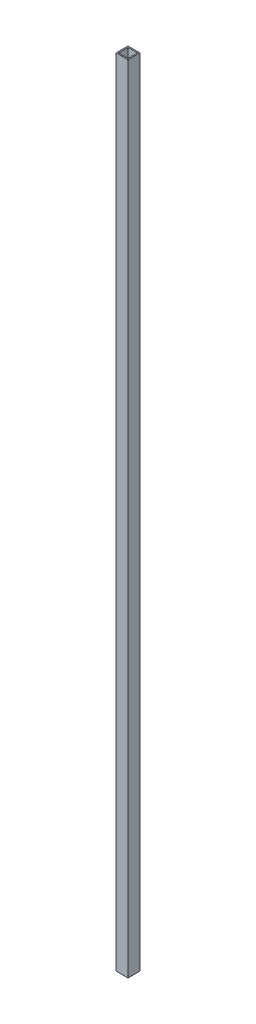
ISO-10303-21;
HEADER;
FILE_DESCRIPTION(('STEP AP214'),'2;1');
FILE_NAME('part.step','',(''),(''),'','','');
FILE_SCHEMA(('AUTOMOTIVE_DESIGN { 1 0 10303 214 1 1 1 1 }'));
ENDSEC;
DATA;
#1=APPLICATION_CONTEXT('core data for automotive mechanical design processes');
#2=APPLICATION_PROTOCOL_DEFINITION('international standard','automotive_design',2000,#1);
#3=PRODUCT_CONTEXT('',#1,'mechanical');
#4=PRODUCT('Part','Part','',(#3));
#5=PRODUCT_RELATED_PRODUCT_CATEGORY('part','',(#4));
#6=PRODUCT_DEFINITION_FORMATION('','',#4);
#7=PRODUCT_DEFINITION_CONTEXT('part definition',#1,'design');
#8=PRODUCT_DEFINITION('design','',#6,#7);
#9=PRODUCT_DEFINITION_SHAPE('','',#8);
#10=(LENGTH_UNIT() NAMED_UNIT(*) SI_UNIT(.MILLI.,.METRE.));
#11=(NAMED_UNIT(*) PLANE_ANGLE_UNIT() SI_UNIT($,.RADIAN.));
#12=(NAMED_UNIT(*) SI_UNIT($,.STERADIAN.) SOLID_ANGLE_UNIT());
#13=UNCERTAINTY_MEASURE_WITH_UNIT(LENGTH_MEASURE(1.E-05),#10,'distance_accuracy_value','');
#14=(GEOMETRIC_REPRESENTATION_CONTEXT(3) GLOBAL_UNCERTAINTY_ASSIGNED_CONTEXT((#13)) GLOBAL_UNIT_ASSIGNED_CONTEXT((#10,
#11,#12)) REPRESENTATION_CONTEXT('',''));
#15=CARTESIAN_POINT('',(0.,0.,0.));
#16=DIRECTION('',(0.,0.,1.));
#17=DIRECTION('',(1.,0.,0.));
#18=AXIS2_PLACEMENT_3D('',#15,#16,#17);
#19=CARTESIAN_POINT('',(0.,1000.,0.));
#20=DIRECTION('',(0.,-1.,0.));
#21=DIRECTION('',(0.,0.,-1.));
#22=AXIS2_PLACEMENT_3D('',#19,#20,#21);
#23=PLANE('',#22);
#24=DIRECTION('',(0.,0.,1.));
#25=VECTOR('',#24,1.);
#26=CARTESIAN_POINT('',(0.,1000.,0.));
#27=LINE('',#26,#25);
#28=CARTESIAN_POINT('',(0.,1000.,-15.));
#29=VERTEX_POINT('',#28);
#30=CARTESIAN_POINT('',(0.,1000.,0.));
#31=VERTEX_POINT('',#30);
#32=EDGE_CURVE('E140',#29,#31,#27,.T.);
#33=ORIENTED_EDGE('',*,*,#32,.T.);
#34=DIRECTION('',(1.,0.,0.));
#35=VECTOR('',#34,1.);
#36=CARTESIAN_POINT('',(0.,1000.,0.));
#37=LINE('',#36,#35);
#38=CARTESIAN_POINT('',(15.,1000.,0.));
#39=VERTEX_POINT('',#38);
#40=EDGE_CURVE('E143',#31,#39,#37,.T.);
#41=ORIENTED_EDGE('',*,*,#40,.T.);
#42=DIRECTION('',(0.,0.,-1.));
#43=VECTOR('',#42,1.);
#44=CARTESIAN_POINT('',(15.,1000.,0.));
#45=LINE('',#44,#43);
#46=CARTESIAN_POINT('',(15.,1000.,-15.));
#47=VERTEX_POINT('',#46);
#48=EDGE_CURVE('E146',#39,#47,#45,.T.);
#49=ORIENTED_EDGE('',*,*,#48,.T.);
#50=DIRECTION('',(-1.,0.,0.));
#51=VECTOR('',#50,1.);
#52=CARTESIAN_POINT('',(0.,1000.,-15.));
#53=LINE('',#52,#51);
#54=EDGE_CURVE('E148',#47,#29,#53,.T.);
#55=ORIENTED_EDGE('',*,*,#54,.T.);
#56=EDGE_LOOP('',(#33,#41,#49,#55));
#57=FACE_BOUND('',#56,.T.);
#58=DIRECTION('',(1.,0.,0.));
#59=VECTOR('',#58,1.);
#60=CARTESIAN_POINT('',(1.5,1000.,-1.5));
#61=LINE('',#60,#59);
#62=CARTESIAN_POINT('',(1.5,1000.,-1.5));
#63=VERTEX_POINT('',#62);
#64=CARTESIAN_POINT('',(13.5,1000.,-1.5));
#65=VERTEX_POINT('',#64);
#66=EDGE_CURVE('E104',#63,#65,#61,.T.);
#67=ORIENTED_EDGE('',*,*,#66,.F.);
#68=DIRECTION('',(0.,0.,1.));
#69=VECTOR('',#68,1.);
#70=CARTESIAN_POINT('',(1.5,1000.,-1.5));
#71=LINE('',#70,#69);
#72=CARTESIAN_POINT('',(1.5,1000.,-13.5));
#73=VERTEX_POINT('',#72);
#74=EDGE_CURVE('E126',#73,#63,#71,.T.);
#75=ORIENTED_EDGE('',*,*,#74,.F.);
#76=DIRECTION('',(-1.,0.,0.));
#77=VECTOR('',#76,1.);
#78=CARTESIAN_POINT('',(1.5,1000.,-13.5));
#79=LINE('',#78,#77);
#80=CARTESIAN_POINT('',(13.5,1000.,-13.5));
#81=VERTEX_POINT('',#80);
#82=EDGE_CURVE('E124',#81,#73,#79,.T.);
#83=ORIENTED_EDGE('',*,*,#82,.F.);
#84=DIRECTION('',(0.,0.,-1.));
#85=VECTOR('',#84,1.);
#86=CARTESIAN_POINT('',(13.5,1000.,-1.5));
#87=LINE('',#86,#85);
#88=EDGE_CURVE('E112',#65,#81,#87,.T.);
#89=ORIENTED_EDGE('',*,*,#88,.F.);
#90=EDGE_LOOP('',(#67,#75,#83,#89));
#91=FACE_BOUND('',#90,.T.);
#92=ADVANCED_FACE('F39',(#57,#91),#23,.F.);
#93=CARTESIAN_POINT('',(0.,0.,0.));
#94=DIRECTION('',(0.,-1.,0.));
#95=DIRECTION('',(0.,0.,-1.));
#96=AXIS2_PLACEMENT_3D('',#93,#94,#95);
#97=PLANE('',#96);
#98=DIRECTION('',(0.,0.,1.));
#99=VECTOR('',#98,1.);
#100=CARTESIAN_POINT('',(0.,0.,0.));
#101=LINE('',#100,#99);
#102=CARTESIAN_POINT('',(0.,0.,-15.));
#103=VERTEX_POINT('',#102);
#104=CARTESIAN_POINT('',(0.,0.,0.));
#105=VERTEX_POINT('',#104);
#106=EDGE_CURVE('E120',#103,#105,#101,.T.);
#107=ORIENTED_EDGE('',*,*,#106,.F.);
#108=DIRECTION('',(-1.,0.,0.));
#109=VECTOR('',#108,1.);
#110=CARTESIAN_POINT('',(0.,0.,-15.));
#111=LINE('',#110,#109);
#112=CARTESIAN_POINT('',(15.,0.,-15.));
#113=VERTEX_POINT('',#112);
#114=EDGE_CURVE('E144',#113,#103,#111,.T.);
#115=ORIENTED_EDGE('',*,*,#114,.F.);
#116=DIRECTION('',(0.,0.,-1.));
#117=VECTOR('',#116,1.);
#118=CARTESIAN_POINT('',(15.,0.,0.));
#119=LINE('',#118,#117);
#120=CARTESIAN_POINT('',(15.,0.,0.));
#121=VERTEX_POINT('',#120);
#122=EDGE_CURVE('E155',#121,#113,#119,.T.);
#123=ORIENTED_EDGE('',*,*,#122,.F.);
#124=DIRECTION('',(1.,0.,0.));
#125=VECTOR('',#124,1.);
#126=CARTESIAN_POINT('',(0.,0.,0.));
#127=LINE('',#126,#125);
#128=EDGE_CURVE('E153',#105,#121,#127,.T.);
#129=ORIENTED_EDGE('',*,*,#128,.F.);
#130=EDGE_LOOP('',(#107,#115,#123,#129));
#131=FACE_BOUND('',#130,.T.);
#132=DIRECTION('',(0.,0.,1.));
#133=VECTOR('',#132,1.);
#134=CARTESIAN_POINT('',(1.5,0.,-1.5));
#135=LINE('',#134,#133);
#136=CARTESIAN_POINT('',(1.5,0.,-13.5));
#137=VERTEX_POINT('',#136);
#138=CARTESIAN_POINT('',(1.5,0.,-1.5));
#139=VERTEX_POINT('',#138);
#140=EDGE_CURVE('E113',#137,#139,#135,.T.);
#141=ORIENTED_EDGE('',*,*,#140,.T.);
#142=DIRECTION('',(1.,0.,0.));
#143=VECTOR('',#142,1.);
#144=CARTESIAN_POINT('',(1.5,0.,-1.5));
#145=LINE('',#144,#143);
#146=CARTESIAN_POINT('',(13.5,0.,-1.5));
#147=VERTEX_POINT('',#146);
#148=EDGE_CURVE('E62',#139,#147,#145,.T.);
#149=ORIENTED_EDGE('',*,*,#148,.T.);
#150=DIRECTION('',(0.,0.,-1.));
#151=VECTOR('',#150,1.);
#152=CARTESIAN_POINT('',(13.5,0.,-1.5));
#153=LINE('',#152,#151);
#154=CARTESIAN_POINT('',(13.5,0.,-13.5));
#155=VERTEX_POINT('',#154);
#156=EDGE_CURVE('E119',#147,#155,#153,.T.);
#157=ORIENTED_EDGE('',*,*,#156,.T.);
#158=DIRECTION('',(-1.,0.,0.));
#159=VECTOR('',#158,1.);
#160=CARTESIAN_POINT('',(1.5,0.,-13.5));
#161=LINE('',#160,#159);
#162=EDGE_CURVE('E132',#155,#137,#161,.T.);
#163=ORIENTED_EDGE('',*,*,#162,.T.);
#164=EDGE_LOOP('',(#141,#149,#157,#163));
#165=FACE_BOUND('',#164,.T.);
#166=ADVANCED_FACE('F173',(#131,#165),#97,.T.);
#167=CARTESIAN_POINT('',(0.,1000.,0.));
#168=DIRECTION('',(1.,0.,0.));
#169=DIRECTION('',(0.,0.,-1.));
#170=AXIS2_PLACEMENT_3D('',#167,#168,#169);
#171=PLANE('',#170);
#172=ORIENTED_EDGE('',*,*,#106,.T.);
#173=DIRECTION('',(0.,-1.,0.));
#174=VECTOR('',#173,1.);
#175=CARTESIAN_POINT('',(0.,1000.,0.));
#176=LINE('',#175,#174);
#177=EDGE_CURVE('E11',#31,#105,#176,.T.);
#178=ORIENTED_EDGE('',*,*,#177,.F.);
#179=ORIENTED_EDGE('',*,*,#32,.F.);
#180=DIRECTION('',(0.,-1.,0.));
#181=VECTOR('',#180,1.);
#182=CARTESIAN_POINT('',(0.,1000.,-15.));
#183=LINE('',#182,#181);
#184=EDGE_CURVE('E150',#29,#103,#183,.T.);
#185=ORIENTED_EDGE('',*,*,#184,.T.);
#186=EDGE_LOOP('',(#172,#178,#179,#185));
#187=FACE_BOUND('',#186,.T.);
#188=ADVANCED_FACE('F41',(#187),#171,.F.);
#189=CARTESIAN_POINT('',(0.,1000.,0.));
#190=DIRECTION('',(0.,0.,-1.));
#191=DIRECTION('',(-1.,0.,0.));
#192=AXIS2_PLACEMENT_3D('',#189,#190,#191);
#193=PLANE('',#192);
#194=ORIENTED_EDGE('',*,*,#128,.T.);
#195=DIRECTION('',(0.,-1.,0.));
#196=VECTOR('',#195,1.);
#197=CARTESIAN_POINT('',(15.,1000.,0.));
#198=LINE('',#197,#196);
#199=EDGE_CURVE('E47',#39,#121,#198,.T.);
#200=ORIENTED_EDGE('',*,*,#199,.F.);
#201=ORIENTED_EDGE('',*,*,#40,.F.);
#202=ORIENTED_EDGE('',*,*,#177,.T.);
#203=EDGE_LOOP('',(#194,#200,#201,#202));
#204=FACE_BOUND('',#203,.T.);
#205=ADVANCED_FACE('F183',(#204),#193,.F.);
#206=CARTESIAN_POINT('',(15.,1000.,0.));
#207=DIRECTION('',(-1.,0.,0.));
#208=DIRECTION('',(0.,0.,1.));
#209=AXIS2_PLACEMENT_3D('',#206,#207,#208);
#210=PLANE('',#209);
#211=ORIENTED_EDGE('',*,*,#122,.T.);
#212=DIRECTION('',(0.,-1.,0.));
#213=VECTOR('',#212,1.);
#214=CARTESIAN_POINT('',(15.,1000.,-15.));
#215=LINE('',#214,#213);
#216=EDGE_CURVE('E160',#47,#113,#215,.T.);
#217=ORIENTED_EDGE('',*,*,#216,.F.);
#218=ORIENTED_EDGE('',*,*,#48,.F.);
#219=ORIENTED_EDGE('',*,*,#199,.T.);
#220=EDGE_LOOP('',(#211,#217,#218,#219));
#221=FACE_BOUND('',#220,.T.);
#222=ADVANCED_FACE('F167',(#221),#210,.F.);
#223=CARTESIAN_POINT('',(0.,1000.,-15.));
#224=DIRECTION('',(0.,0.,1.));
#225=DIRECTION('',(1.,0.,0.));
#226=AXIS2_PLACEMENT_3D('',#223,#224,#225);
#227=PLANE('',#226);
#228=ORIENTED_EDGE('',*,*,#114,.T.);
#229=ORIENTED_EDGE('',*,*,#184,.F.);
#230=ORIENTED_EDGE('',*,*,#54,.F.);
#231=ORIENTED_EDGE('',*,*,#216,.T.);
#232=EDGE_LOOP('',(#228,#229,#230,#231));
#233=FACE_BOUND('',#232,.T.);
#234=ADVANCED_FACE('F177',(#233),#227,.F.);
#235=CARTESIAN_POINT('',(1.5,1000.,-1.5));
#236=DIRECTION('',(0.,0.,-1.));
#237=DIRECTION('',(-1.,0.,0.));
#238=AXIS2_PLACEMENT_3D('',#235,#236,#237);
#239=PLANE('',#238);
#240=ORIENTED_EDGE('',*,*,#148,.F.);
#241=DIRECTION('',(0.,-1.,0.));
#242=VECTOR('',#241,1.);
#243=CARTESIAN_POINT('',(1.5,1000.,-1.5));
#244=LINE('',#243,#242);
#245=EDGE_CURVE('E108',#63,#139,#244,.T.);
#246=ORIENTED_EDGE('',*,*,#245,.F.);
#247=ORIENTED_EDGE('',*,*,#66,.T.);
#248=DIRECTION('',(0.,-1.,0.));
#249=VECTOR('',#248,1.);
#250=CARTESIAN_POINT('',(13.5,1000.,-1.5));
#251=LINE('',#250,#249);
#252=EDGE_CURVE('E107',#65,#147,#251,.T.);
#253=ORIENTED_EDGE('',*,*,#252,.T.);
#254=EDGE_LOOP('',(#240,#246,#247,#253));
#255=FACE_BOUND('',#254,.T.);
#256=ADVANCED_FACE('F106',(#255),#239,.T.);
#257=CARTESIAN_POINT('',(13.5,1000.,-1.5));
#258=DIRECTION('',(-1.,0.,0.));
#259=DIRECTION('',(0.,0.,1.));
#260=AXIS2_PLACEMENT_3D('',#257,#258,#259);
#261=PLANE('',#260);
#262=ORIENTED_EDGE('',*,*,#156,.F.);
#263=ORIENTED_EDGE('',*,*,#252,.F.);
#264=ORIENTED_EDGE('',*,*,#88,.T.);
#265=DIRECTION('',(0.,-1.,0.));
#266=VECTOR('',#265,1.);
#267=CARTESIAN_POINT('',(13.5,1000.,-13.5));
#268=LINE('',#267,#266);
#269=EDGE_CURVE('E121',#81,#155,#268,.T.);
#270=ORIENTED_EDGE('',*,*,#269,.T.);
#271=EDGE_LOOP('',(#262,#263,#264,#270));
#272=FACE_BOUND('',#271,.T.);
#273=ADVANCED_FACE('F116',(#272),#261,.T.);
#274=CARTESIAN_POINT('',(1.5,1000.,-13.5));
#275=DIRECTION('',(0.,0.,1.));
#276=DIRECTION('',(1.,0.,0.));
#277=AXIS2_PLACEMENT_3D('',#274,#275,#276);
#278=PLANE('',#277);
#279=ORIENTED_EDGE('',*,*,#162,.F.);
#280=ORIENTED_EDGE('',*,*,#269,.F.);
#281=ORIENTED_EDGE('',*,*,#82,.T.);
#282=DIRECTION('',(0.,-1.,0.));
#283=VECTOR('',#282,1.);
#284=CARTESIAN_POINT('',(1.5,1000.,-13.5));
#285=LINE('',#284,#283);
#286=EDGE_CURVE('E54',#73,#137,#285,.T.);
#287=ORIENTED_EDGE('',*,*,#286,.T.);
#288=EDGE_LOOP('',(#279,#280,#281,#287));
#289=FACE_BOUND('',#288,.T.);
#290=ADVANCED_FACE('F206',(#289),#278,.T.);
#291=CARTESIAN_POINT('',(1.5,1000.,-1.5));
#292=DIRECTION('',(1.,0.,0.));
#293=DIRECTION('',(0.,0.,-1.));
#294=AXIS2_PLACEMENT_3D('',#291,#292,#293);
#295=PLANE('',#294);
#296=ORIENTED_EDGE('',*,*,#140,.F.);
#297=ORIENTED_EDGE('',*,*,#286,.F.);
#298=ORIENTED_EDGE('',*,*,#74,.T.);
#299=ORIENTED_EDGE('',*,*,#245,.T.);
#300=EDGE_LOOP('',(#296,#297,#298,#299));
#301=FACE_BOUND('',#300,.T.);
#302=ADVANCED_FACE('F210',(#301),#295,.T.);
#303=CLOSED_SHELL('',(#92,#166,#188,#205,#222,#234,#256,#273,#290,#302));
#304=MANIFOLD_SOLID_BREP('B2',#303);
#305=ADVANCED_BREP_SHAPE_REPRESENTATION('',(#18,#304),#14);
#306=SHAPE_DEFINITION_REPRESENTATION(#9,#305);
ENDSEC;
END-ISO-10303-21;
